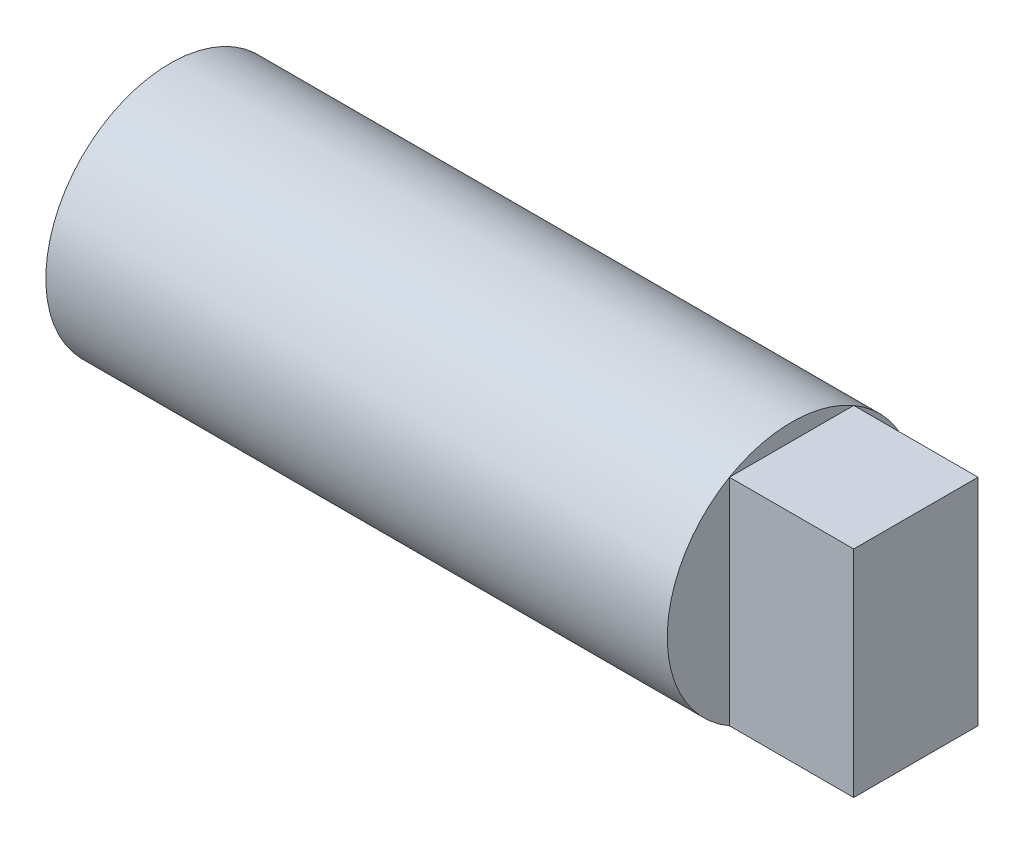
ISO-10303-21;
HEADER;
FILE_DESCRIPTION(('STEP AP214'),'2;1');
FILE_NAME('part.step','',(''),(''),'','','');
FILE_SCHEMA(('AUTOMOTIVE_DESIGN { 1 0 10303 214 1 1 1 1 }'));
ENDSEC;
DATA;
#1=APPLICATION_CONTEXT('core data for automotive mechanical design processes');
#2=APPLICATION_PROTOCOL_DEFINITION('international standard','automotive_design',2000,#1);
#3=PRODUCT_CONTEXT('',#1,'mechanical');
#4=PRODUCT('Part','Part','',(#3));
#5=PRODUCT_RELATED_PRODUCT_CATEGORY('part','',(#4));
#6=PRODUCT_DEFINITION_FORMATION('','',#4);
#7=PRODUCT_DEFINITION_CONTEXT('part definition',#1,'design');
#8=PRODUCT_DEFINITION('design','',#6,#7);
#9=PRODUCT_DEFINITION_SHAPE('','',#8);
#10=(LENGTH_UNIT() NAMED_UNIT(*) SI_UNIT(.MILLI.,.METRE.));
#11=(NAMED_UNIT(*) PLANE_ANGLE_UNIT() SI_UNIT($,.RADIAN.));
#12=(NAMED_UNIT(*) SI_UNIT($,.STERADIAN.) SOLID_ANGLE_UNIT());
#13=UNCERTAINTY_MEASURE_WITH_UNIT(LENGTH_MEASURE(1.E-05),#10,'distance_accuracy_value','');
#14=(GEOMETRIC_REPRESENTATION_CONTEXT(3) GLOBAL_UNCERTAINTY_ASSIGNED_CONTEXT((#13)) GLOBAL_UNIT_ASSIGNED_CONTEXT((#10,
#11,#12)) REPRESENTATION_CONTEXT('',''));
#15=CARTESIAN_POINT('',(0.,0.,0.));
#16=DIRECTION('',(0.,0.,1.));
#17=DIRECTION('',(1.,0.,0.));
#18=AXIS2_PLACEMENT_3D('',#15,#16,#17);
#19=CARTESIAN_POINT('',(50.,0.,0.));
#20=DIRECTION('',(1.,0.,0.));
#21=DIRECTION('',(0.,0.,-1.));
#22=AXIS2_PLACEMENT_3D('',#19,#20,#21);
#23=PLANE('',#22);
#24=DIRECTION('',(0.,1.,0.));
#25=VECTOR('',#24,1.);
#26=CARTESIAN_POINT('',(50.,-8.66025403784439,-5.));
#27=LINE('',#26,#25);
#28=CARTESIAN_POINT('',(50.,-8.66025403784439,-5.));
#29=VERTEX_POINT('',#28);
#30=CARTESIAN_POINT('',(50.,8.66025403784439,-5.));
#31=VERTEX_POINT('',#30);
#32=EDGE_CURVE('E54',#29,#31,#27,.T.);
#33=ORIENTED_EDGE('',*,*,#32,.F.);
#34=CARTESIAN_POINT('',(50.,0.,0.));
#35=DIRECTION('',(1.,0.,0.));
#36=DIRECTION('',(0.,0.,-1.));
#37=AXIS2_PLACEMENT_3D('',#34,#35,#36);
#38=CIRCLE('',#37,10.);
#39=EDGE_CURVE('E105',#29,#31,#38,.T.);
#40=ORIENTED_EDGE('',*,*,#39,.T.);
#41=EDGE_LOOP('',(#33,#40));
#42=FACE_BOUND('',#41,.T.);
#43=ADVANCED_FACE('F40',(#42),#23,.T.);
#44=DIRECTION('',(0.,0.,-1.));
#45=VECTOR('',#44,1.);
#46=CARTESIAN_POINT('',(50.,-8.66025403784439,5.));
#47=LINE('',#46,#45);
#48=CARTESIAN_POINT('',(50.,-8.66025403784439,5.));
#49=VERTEX_POINT('',#48);
#50=EDGE_CURVE('E61',#49,#29,#47,.T.);
#51=ORIENTED_EDGE('',*,*,#50,.F.);
#52=EDGE_CURVE('E107',#49,#29,#38,.T.);
#53=ORIENTED_EDGE('',*,*,#52,.T.);
#54=EDGE_LOOP('',(#51,#53));
#55=FACE_BOUND('',#54,.T.);
#56=ADVANCED_FACE('F119',(#55),#23,.T.);
#57=DIRECTION('',(0.,-1.,0.));
#58=VECTOR('',#57,1.);
#59=CARTESIAN_POINT('',(50.,-8.66025403784439,5.));
#60=LINE('',#59,#58);
#61=CARTESIAN_POINT('',(50.,8.66025403784439,5.));
#62=VERTEX_POINT('',#61);
#63=EDGE_CURVE('E126',#62,#49,#60,.T.);
#64=ORIENTED_EDGE('',*,*,#63,.F.);
#65=EDGE_CURVE('E111',#62,#49,#38,.T.);
#66=ORIENTED_EDGE('',*,*,#65,.T.);
#67=EDGE_LOOP('',(#64,#66));
#68=FACE_BOUND('',#67,.T.);
#69=ADVANCED_FACE('F137',(#68),#23,.T.);
#70=CARTESIAN_POINT('',(0.,0.,0.));
#71=DIRECTION('',(1.,0.,0.));
#72=DIRECTION('',(0.,0.,-1.));
#73=AXIS2_PLACEMENT_3D('',#70,#71,#72);
#74=PLANE('',#73);
#75=CARTESIAN_POINT('',(0.,0.,0.));
#76=DIRECTION('',(1.,0.,0.));
#77=DIRECTION('',(0.,0.,-1.));
#78=AXIS2_PLACEMENT_3D('',#75,#76,#77);
#79=CIRCLE('',#78,10.);
#80=CARTESIAN_POINT('',(0.,0.,-10.));
#81=VERTEX_POINT('',#80);
#82=EDGE_CURVE('E11',#81,#81,#79,.T.);
#83=ORIENTED_EDGE('',*,*,#82,.F.);
#84=EDGE_LOOP('',(#83));
#85=FACE_BOUND('',#84,.T.);
#86=ADVANCED_FACE('F42',(#85),#74,.F.);
#87=CARTESIAN_POINT('',(0.,0.,0.));
#88=DIRECTION('',(1.,0.,0.));
#89=DIRECTION('',(0.,0.,-1.));
#90=AXIS2_PLACEMENT_3D('',#87,#88,#89);
#91=CYLINDRICAL_SURFACE('',#90,10.);
#92=ORIENTED_EDGE('',*,*,#82,.T.);
#93=EDGE_LOOP('',(#92));
#94=FACE_BOUND('',#93,.T.);
#95=EDGE_CURVE('E48',#31,#62,#38,.T.);
#96=ORIENTED_EDGE('',*,*,#95,.F.);
#97=ORIENTED_EDGE('',*,*,#39,.F.);
#98=ORIENTED_EDGE('',*,*,#52,.F.);
#99=ORIENTED_EDGE('',*,*,#65,.F.);
#100=EDGE_LOOP('',(#96,#97,#98,#99));
#101=FACE_BOUND('',#100,.T.);
#102=ADVANCED_FACE('F139',(#94,#101),#91,.T.);
#103=DIRECTION('',(0.,0.,1.));
#104=VECTOR('',#103,1.);
#105=CARTESIAN_POINT('',(50.,8.66025403784439,5.));
#106=LINE('',#105,#104);
#107=EDGE_CURVE('E132',#31,#62,#106,.T.);
#108=ORIENTED_EDGE('',*,*,#107,.F.);
#109=ORIENTED_EDGE('',*,*,#95,.T.);
#110=EDGE_LOOP('',(#108,#109));
#111=FACE_BOUND('',#110,.T.);
#112=ADVANCED_FACE('F138',(#111),#23,.T.);
#113=CARTESIAN_POINT('',(60.,-8.66025403784439,-5.));
#114=DIRECTION('',(0.,0.,1.));
#115=DIRECTION('',(0.,-1.,0.));
#116=AXIS2_PLACEMENT_3D('',#113,#114,#115);
#117=PLANE('',#116);
#118=ORIENTED_EDGE('',*,*,#32,.T.);
#119=DIRECTION('',(-1.,0.,0.));
#120=VECTOR('',#119,1.);
#121=CARTESIAN_POINT('',(60.,8.66025403784439,-5.));
#122=LINE('',#121,#120);
#123=CARTESIAN_POINT('',(60.,8.66025403784439,-5.));
#124=VERTEX_POINT('',#123);
#125=EDGE_CURVE('E88',#124,#31,#122,.T.);
#126=ORIENTED_EDGE('',*,*,#125,.F.);
#127=DIRECTION('',(0.,1.,0.));
#128=VECTOR('',#127,1.);
#129=CARTESIAN_POINT('',(60.,-8.66025403784439,-5.));
#130=LINE('',#129,#128);
#131=CARTESIAN_POINT('',(60.,-8.66025403784439,-5.));
#132=VERTEX_POINT('',#131);
#133=EDGE_CURVE('E94',#132,#124,#130,.T.);
#134=ORIENTED_EDGE('',*,*,#133,.F.);
#135=DIRECTION('',(-1.,0.,0.));
#136=VECTOR('',#135,1.);
#137=CARTESIAN_POINT('',(60.,-8.66025403784439,-5.));
#138=LINE('',#137,#136);
#139=EDGE_CURVE('E124',#132,#29,#138,.T.);
#140=ORIENTED_EDGE('',*,*,#139,.T.);
#141=EDGE_LOOP('',(#118,#126,#134,#140));
#142=FACE_BOUND('',#141,.T.);
#143=ADVANCED_FACE('F104',(#142),#117,.F.);
#144=CARTESIAN_POINT('',(60.,8.66025403784439,5.));
#145=DIRECTION('',(0.,-1.,0.));
#146=DIRECTION('',(0.,0.,-1.));
#147=AXIS2_PLACEMENT_3D('',#144,#145,#146);
#148=PLANE('',#147);
#149=ORIENTED_EDGE('',*,*,#107,.T.);
#150=DIRECTION('',(-1.,0.,0.));
#151=VECTOR('',#150,1.);
#152=CARTESIAN_POINT('',(60.,8.66025403784439,5.));
#153=LINE('',#152,#151);
#154=CARTESIAN_POINT('',(60.,8.66025403784439,5.));
#155=VERTEX_POINT('',#154);
#156=EDGE_CURVE('E90',#155,#62,#153,.T.);
#157=ORIENTED_EDGE('',*,*,#156,.F.);
#158=DIRECTION('',(0.,0.,1.));
#159=VECTOR('',#158,1.);
#160=CARTESIAN_POINT('',(60.,8.66025403784439,5.));
#161=LINE('',#160,#159);
#162=EDGE_CURVE('E83',#124,#155,#161,.T.);
#163=ORIENTED_EDGE('',*,*,#162,.F.);
#164=ORIENTED_EDGE('',*,*,#125,.T.);
#165=EDGE_LOOP('',(#149,#157,#163,#164));
#166=FACE_BOUND('',#165,.T.);
#167=ADVANCED_FACE('F86',(#166),#148,.F.);
#168=CARTESIAN_POINT('',(60.,-8.66025403784439,5.));
#169=DIRECTION('',(0.,0.,-1.));
#170=DIRECTION('',(-1.,0.,0.));
#171=AXIS2_PLACEMENT_3D('',#168,#169,#170);
#172=PLANE('',#171);
#173=ORIENTED_EDGE('',*,*,#63,.T.);
#174=DIRECTION('',(-1.,0.,0.));
#175=VECTOR('',#174,1.);
#176=CARTESIAN_POINT('',(60.,-8.66025403784439,5.));
#177=LINE('',#176,#175);
#178=CARTESIAN_POINT('',(60.,-8.66025403784439,5.));
#179=VERTEX_POINT('',#178);
#180=EDGE_CURVE('E108',#179,#49,#177,.T.);
#181=ORIENTED_EDGE('',*,*,#180,.F.);
#182=DIRECTION('',(0.,-1.,0.));
#183=VECTOR('',#182,1.);
#184=CARTESIAN_POINT('',(60.,-8.66025403784439,5.));
#185=LINE('',#184,#183);
#186=EDGE_CURVE('E93',#155,#179,#185,.T.);
#187=ORIENTED_EDGE('',*,*,#186,.F.);
#188=ORIENTED_EDGE('',*,*,#156,.T.);
#189=EDGE_LOOP('',(#173,#181,#187,#188));
#190=FACE_BOUND('',#189,.T.);
#191=ADVANCED_FACE('F136',(#190),#172,.F.);
#192=CARTESIAN_POINT('',(60.,-8.66025403784439,5.));
#193=DIRECTION('',(0.,1.,0.));
#194=DIRECTION('',(0.,0.,1.));
#195=AXIS2_PLACEMENT_3D('',#192,#193,#194);
#196=PLANE('',#195);
#197=ORIENTED_EDGE('',*,*,#50,.T.);
#198=ORIENTED_EDGE('',*,*,#139,.F.);
#199=DIRECTION('',(0.,0.,-1.));
#200=VECTOR('',#199,1.);
#201=CARTESIAN_POINT('',(60.,-8.66025403784439,5.));
#202=LINE('',#201,#200);
#203=EDGE_CURVE('E99',#179,#132,#202,.T.);
#204=ORIENTED_EDGE('',*,*,#203,.F.);
#205=ORIENTED_EDGE('',*,*,#180,.T.);
#206=EDGE_LOOP('',(#197,#198,#204,#205));
#207=FACE_BOUND('',#206,.T.);
#208=ADVANCED_FACE('F123',(#207),#196,.F.);
#209=CARTESIAN_POINT('',(60.,0.,0.));
#210=DIRECTION('',(-1.,0.,0.));
#211=DIRECTION('',(0.,0.,1.));
#212=AXIS2_PLACEMENT_3D('',#209,#210,#211);
#213=PLANE('',#212);
#214=ORIENTED_EDGE('',*,*,#133,.T.);
#215=ORIENTED_EDGE('',*,*,#162,.T.);
#216=ORIENTED_EDGE('',*,*,#186,.T.);
#217=ORIENTED_EDGE('',*,*,#203,.T.);
#218=EDGE_LOOP('',(#214,#215,#216,#217));
#219=FACE_BOUND('',#218,.T.);
#220=ADVANCED_FACE('F97',(#219),#213,.F.);
#221=CLOSED_SHELL('',(#43,#56,#69,#86,#102,#112,#143,#167,#191,#208,#220));
#222=MANIFOLD_SOLID_BREP('B2',#221);
#223=ADVANCED_BREP_SHAPE_REPRESENTATION('',(#18,#222),#14);
#224=SHAPE_DEFINITION_REPRESENTATION(#9,#223);
ENDSEC;
END-ISO-10303-21;
